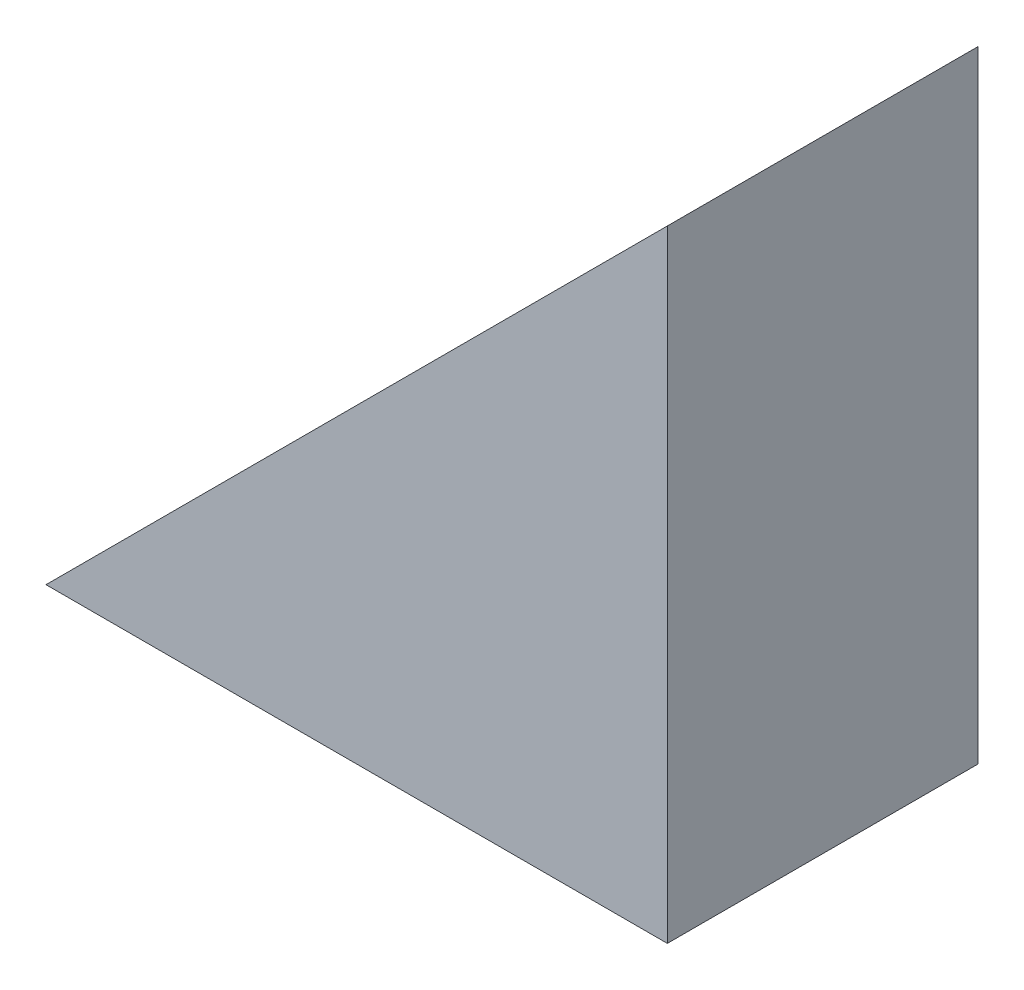
ISO-10303-21;
HEADER;
FILE_DESCRIPTION(('STEP AP214'),'2;1');
FILE_NAME('part.step','',(''),(''),'','','');
FILE_SCHEMA(('AUTOMOTIVE_DESIGN { 1 0 10303 214 1 1 1 1 }'));
ENDSEC;
DATA;
#1=APPLICATION_CONTEXT('core data for automotive mechanical design processes');
#2=APPLICATION_PROTOCOL_DEFINITION('international standard','automotive_design',2000,#1);
#3=PRODUCT_CONTEXT('',#1,'mechanical');
#4=PRODUCT('Part','Part','',(#3));
#5=PRODUCT_RELATED_PRODUCT_CATEGORY('part','',(#4));
#6=PRODUCT_DEFINITION_FORMATION('','',#4);
#7=PRODUCT_DEFINITION_CONTEXT('part definition',#1,'design');
#8=PRODUCT_DEFINITION('design','',#6,#7);
#9=PRODUCT_DEFINITION_SHAPE('','',#8);
#10=(LENGTH_UNIT() NAMED_UNIT(*) SI_UNIT(.MILLI.,.METRE.));
#11=(NAMED_UNIT(*) PLANE_ANGLE_UNIT() SI_UNIT($,.RADIAN.));
#12=(NAMED_UNIT(*) SI_UNIT($,.STERADIAN.) SOLID_ANGLE_UNIT());
#13=UNCERTAINTY_MEASURE_WITH_UNIT(LENGTH_MEASURE(1.E-05),#10,'distance_accuracy_value','');
#14=(GEOMETRIC_REPRESENTATION_CONTEXT(3) GLOBAL_UNCERTAINTY_ASSIGNED_CONTEXT((#13)) GLOBAL_UNIT_ASSIGNED_CONTEXT((#10,
#11,#12)) REPRESENTATION_CONTEXT('',''));
#15=CARTESIAN_POINT('',(0.,0.,0.));
#16=DIRECTION('',(0.,0.,1.));
#17=DIRECTION('',(1.,0.,0.));
#18=AXIS2_PLACEMENT_3D('',#15,#16,#17);
#19=CARTESIAN_POINT('',(40.,40.,20.));
#20=DIRECTION('',(0.707106781186548,-0.707106781186548,0.));
#21=DIRECTION('',(0.707106781186548,0.707106781186548,0.));
#22=AXIS2_PLACEMENT_3D('',#19,#20,#21);
#23=PLANE('',#22);
#24=DIRECTION('',(-0.707106781186548,-0.707106781186548,0.));
#25=VECTOR('',#24,1.);
#26=CARTESIAN_POINT('',(40.,40.,0.));
#27=LINE('',#26,#25);
#28=CARTESIAN_POINT('',(40.,40.,0.));
#29=VERTEX_POINT('',#28);
#30=CARTESIAN_POINT('',(0.,0.,0.));
#31=VERTEX_POINT('',#30);
#32=EDGE_CURVE('E80',#29,#31,#27,.T.);
#33=ORIENTED_EDGE('',*,*,#32,.T.);
#34=DIRECTION('',(0.,0.,-1.));
#35=VECTOR('',#34,1.);
#36=CARTESIAN_POINT('',(0.,0.,20.));
#37=LINE('',#36,#35);
#38=CARTESIAN_POINT('',(0.,0.,20.));
#39=VERTEX_POINT('',#38);
#40=EDGE_CURVE('E11',#39,#31,#37,.T.);
#41=ORIENTED_EDGE('',*,*,#40,.F.);
#42=DIRECTION('',(-0.707106781186548,-0.707106781186548,0.));
#43=VECTOR('',#42,1.);
#44=CARTESIAN_POINT('',(40.,40.,20.));
#45=LINE('',#44,#43);
#46=CARTESIAN_POINT('',(40.,40.,20.));
#47=VERTEX_POINT('',#46);
#48=EDGE_CURVE('E73',#47,#39,#45,.T.);
#49=ORIENTED_EDGE('',*,*,#48,.F.);
#50=DIRECTION('',(0.,0.,-1.));
#51=VECTOR('',#50,1.);
#52=CARTESIAN_POINT('',(40.,40.,20.));
#53=LINE('',#52,#51);
#54=EDGE_CURVE('E81',#47,#29,#53,.T.);
#55=ORIENTED_EDGE('',*,*,#54,.T.);
#56=EDGE_LOOP('',(#33,#41,#49,#55));
#57=FACE_BOUND('',#56,.T.);
#58=ADVANCED_FACE('F33',(#57),#23,.F.);
#59=CARTESIAN_POINT('',(0.,0.,20.));
#60=DIRECTION('',(0.,1.,0.));
#61=DIRECTION('',(0.,0.,1.));
#62=AXIS2_PLACEMENT_3D('',#59,#60,#61);
#63=PLANE('',#62);
#64=DIRECTION('',(1.,0.,0.));
#65=VECTOR('',#64,1.);
#66=CARTESIAN_POINT('',(0.,0.,0.));
#67=LINE('',#66,#65);
#68=CARTESIAN_POINT('',(40.,0.,0.));
#69=VERTEX_POINT('',#68);
#70=EDGE_CURVE('E61',#31,#69,#67,.T.);
#71=ORIENTED_EDGE('',*,*,#70,.T.);
#72=DIRECTION('',(0.,0.,-1.));
#73=VECTOR('',#72,1.);
#74=CARTESIAN_POINT('',(40.,0.,20.));
#75=LINE('',#74,#73);
#76=CARTESIAN_POINT('',(40.,0.,20.));
#77=VERTEX_POINT('',#76);
#78=EDGE_CURVE('E41',#77,#69,#75,.T.);
#79=ORIENTED_EDGE('',*,*,#78,.F.);
#80=DIRECTION('',(1.,0.,0.));
#81=VECTOR('',#80,1.);
#82=CARTESIAN_POINT('',(0.,0.,20.));
#83=LINE('',#82,#81);
#84=EDGE_CURVE('E69',#39,#77,#83,.T.);
#85=ORIENTED_EDGE('',*,*,#84,.F.);
#86=ORIENTED_EDGE('',*,*,#40,.T.);
#87=EDGE_LOOP('',(#71,#79,#85,#86));
#88=FACE_BOUND('',#87,.T.);
#89=ADVANCED_FACE('F70',(#88),#63,.F.);
#90=CARTESIAN_POINT('',(40.,0.,20.));
#91=DIRECTION('',(-1.,0.,0.));
#92=DIRECTION('',(0.,0.,1.));
#93=AXIS2_PLACEMENT_3D('',#90,#91,#92);
#94=PLANE('',#93);
#95=DIRECTION('',(0.,1.,0.));
#96=VECTOR('',#95,1.);
#97=CARTESIAN_POINT('',(40.,0.,0.));
#98=LINE('',#97,#96);
#99=EDGE_CURVE('E66',#69,#29,#98,.T.);
#100=ORIENTED_EDGE('',*,*,#99,.T.);
#101=ORIENTED_EDGE('',*,*,#54,.F.);
#102=DIRECTION('',(0.,1.,0.));
#103=VECTOR('',#102,1.);
#104=CARTESIAN_POINT('',(40.,0.,20.));
#105=LINE('',#104,#103);
#106=EDGE_CURVE('E49',#77,#47,#105,.T.);
#107=ORIENTED_EDGE('',*,*,#106,.F.);
#108=ORIENTED_EDGE('',*,*,#78,.T.);
#109=EDGE_LOOP('',(#100,#101,#107,#108));
#110=FACE_BOUND('',#109,.T.);
#111=ADVANCED_FACE('F88',(#110),#94,.F.);
#112=CARTESIAN_POINT('',(0.,0.,20.));
#113=DIRECTION('',(0.,0.,1.));
#114=DIRECTION('',(1.,0.,0.));
#115=AXIS2_PLACEMENT_3D('',#112,#113,#114);
#116=PLANE('',#115);
#117=ORIENTED_EDGE('',*,*,#48,.T.);
#118=ORIENTED_EDGE('',*,*,#84,.T.);
#119=ORIENTED_EDGE('',*,*,#106,.T.);
#120=EDGE_LOOP('',(#117,#118,#119));
#121=FACE_BOUND('',#120,.T.);
#122=ADVANCED_FACE('F76',(#121),#116,.T.);
#123=CARTESIAN_POINT('',(0.,0.,0.));
#124=DIRECTION('',(0.,0.,1.));
#125=DIRECTION('',(1.,0.,0.));
#126=AXIS2_PLACEMENT_3D('',#123,#124,#125);
#127=PLANE('',#126);
#128=ORIENTED_EDGE('',*,*,#32,.F.);
#129=ORIENTED_EDGE('',*,*,#99,.F.);
#130=ORIENTED_EDGE('',*,*,#70,.F.);
#131=EDGE_LOOP('',(#128,#129,#130));
#132=FACE_BOUND('',#131,.T.);
#133=ADVANCED_FACE('F89',(#132),#127,.F.);
#134=CLOSED_SHELL('',(#58,#89,#111,#122,#133));
#135=MANIFOLD_SOLID_BREP('B2',#134);
#136=ADVANCED_BREP_SHAPE_REPRESENTATION('',(#18,#135),#14);
#137=SHAPE_DEFINITION_REPRESENTATION(#9,#136);
ENDSEC;
END-ISO-10303-21;
